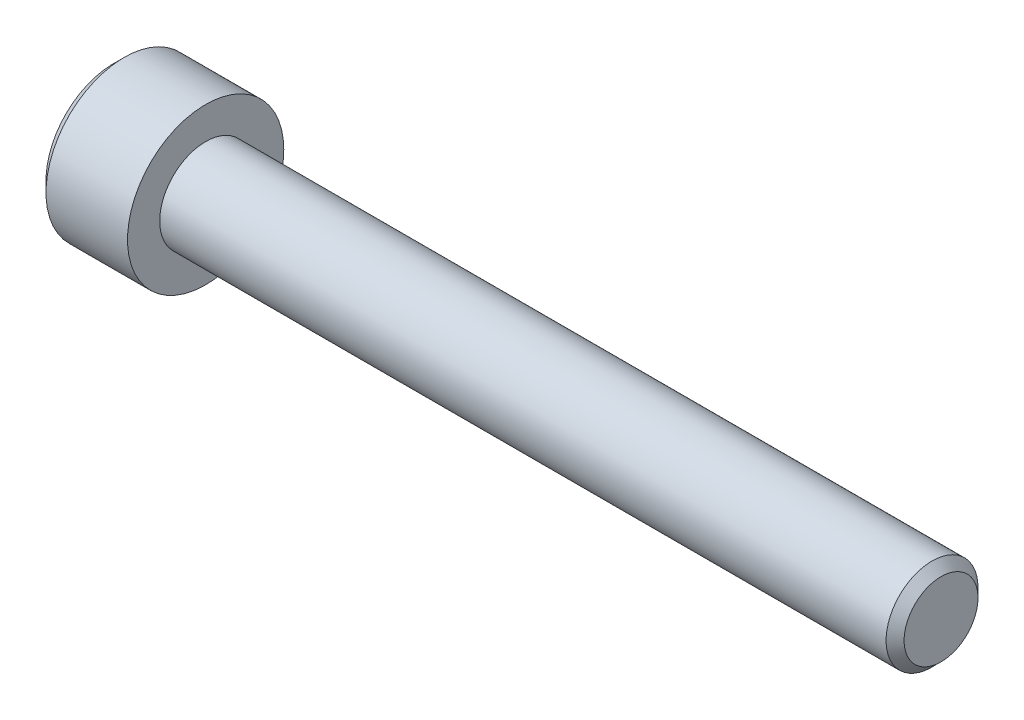
ISO-10303-21;
HEADER;
FILE_DESCRIPTION(('STEP AP214'),'2;1');
FILE_NAME('part.step','',(''),(''),'','','');
FILE_SCHEMA(('AUTOMOTIVE_DESIGN { 1 0 10303 214 1 1 1 1 }'));
ENDSEC;
DATA;
#1=APPLICATION_CONTEXT('core data for automotive mechanical design processes');
#2=APPLICATION_PROTOCOL_DEFINITION('international standard','automotive_design',2000,#1);
#3=PRODUCT_CONTEXT('',#1,'mechanical');
#4=PRODUCT('Part','Part','',(#3));
#5=PRODUCT_RELATED_PRODUCT_CATEGORY('part','',(#4));
#6=PRODUCT_DEFINITION_FORMATION('','',#4);
#7=PRODUCT_DEFINITION_CONTEXT('part definition',#1,'design');
#8=PRODUCT_DEFINITION('design','',#6,#7);
#9=PRODUCT_DEFINITION_SHAPE('','',#8);
#10=(LENGTH_UNIT() NAMED_UNIT(*) SI_UNIT(.MILLI.,.METRE.));
#11=(NAMED_UNIT(*) PLANE_ANGLE_UNIT() SI_UNIT($,.RADIAN.));
#12=(NAMED_UNIT(*) SI_UNIT($,.STERADIAN.) SOLID_ANGLE_UNIT());
#13=UNCERTAINTY_MEASURE_WITH_UNIT(LENGTH_MEASURE(1.E-05),#10,'distance_accuracy_value','');
#14=(GEOMETRIC_REPRESENTATION_CONTEXT(3) GLOBAL_UNCERTAINTY_ASSIGNED_CONTEXT((#13)) GLOBAL_UNIT_ASSIGNED_CONTEXT((#10,
#11,#12)) REPRESENTATION_CONTEXT('',''));
#15=CARTESIAN_POINT('',(0.,0.,0.));
#16=DIRECTION('',(0.,0.,1.));
#17=DIRECTION('',(1.,0.,0.));
#18=AXIS2_PLACEMENT_3D('',#15,#16,#17);
#19=CARTESIAN_POINT('',(-5.,0.,0.));
#20=DIRECTION('',(1.,0.,0.));
#21=DIRECTION('',(0.,0.,-1.));
#22=AXIS2_PLACEMENT_3D('',#19,#20,#21);
#23=PLANE('',#22);
#24=CARTESIAN_POINT('',(-5.,0.,0.));
#25=DIRECTION('',(1.,0.,0.));
#26=DIRECTION('',(0.,0.,-1.));
#27=AXIS2_PLACEMENT_3D('',#24,#25,#26);
#28=CIRCLE('',#27,3.68333333333333);
#29=CARTESIAN_POINT('',(-5.,0.,-3.68333333333333));
#30=VERTEX_POINT('',#29);
#31=EDGE_CURVE('E10',#30,#30,#28,.T.);
#32=ORIENTED_EDGE('',*,*,#31,.F.);
#33=EDGE_LOOP('',(#32));
#34=FACE_BOUND('',#33,.T.);
#35=DIRECTION('',(0.,0.5,-0.866025403784439));
#36=VECTOR('',#35,1.);
#37=CARTESIAN_POINT('',(-5.,-2.3094010767585,0.));
#38=LINE('',#37,#36);
#39=CARTESIAN_POINT('',(-5.,-2.3094010767585,0.));
#40=VERTEX_POINT('',#39);
#41=CARTESIAN_POINT('',(-5.,-1.15470053837925,-2.));
#42=VERTEX_POINT('',#41);
#43=EDGE_CURVE('E152',#40,#42,#38,.T.);
#44=ORIENTED_EDGE('',*,*,#43,.T.);
#45=DIRECTION('',(0.,1.,0.));
#46=VECTOR('',#45,1.);
#47=CARTESIAN_POINT('',(-5.,-1.15470053837925,-2.));
#48=LINE('',#47,#46);
#49=CARTESIAN_POINT('',(-5.,1.15470053837925,-2.));
#50=VERTEX_POINT('',#49);
#51=EDGE_CURVE('E154',#42,#50,#48,.T.);
#52=ORIENTED_EDGE('',*,*,#51,.T.);
#53=DIRECTION('',(0.,0.5,0.866025403784439));
#54=VECTOR('',#53,1.);
#55=CARTESIAN_POINT('',(-5.,1.15470053837925,-2.));
#56=LINE('',#55,#54);
#57=CARTESIAN_POINT('',(-5.,2.3094010767585,0.));
#58=VERTEX_POINT('',#57);
#59=EDGE_CURVE('E157',#50,#58,#56,.T.);
#60=ORIENTED_EDGE('',*,*,#59,.T.);
#61=DIRECTION('',(0.,-0.5,0.866025403784439));
#62=VECTOR('',#61,1.);
#63=CARTESIAN_POINT('',(-5.,2.3094010767585,0.));
#64=LINE('',#63,#62);
#65=CARTESIAN_POINT('',(-5.,1.15470053837925,2.));
#66=VERTEX_POINT('',#65);
#67=EDGE_CURVE('E99',#58,#66,#64,.T.);
#68=ORIENTED_EDGE('',*,*,#67,.T.);
#69=DIRECTION('',(0.,-1.,0.));
#70=VECTOR('',#69,1.);
#71=CARTESIAN_POINT('',(-5.,1.15470053837925,2.));
#72=LINE('',#71,#70);
#73=CARTESIAN_POINT('',(-5.,-1.15470053837925,2.));
#74=VERTEX_POINT('',#73);
#75=EDGE_CURVE('E159',#66,#74,#72,.T.);
#76=ORIENTED_EDGE('',*,*,#75,.T.);
#77=DIRECTION('',(0.,-0.5,-0.866025403784439));
#78=VECTOR('',#77,1.);
#79=CARTESIAN_POINT('',(-5.,-1.15470053837925,2.));
#80=LINE('',#79,#78);
#81=EDGE_CURVE('E114',#74,#40,#80,.T.);
#82=ORIENTED_EDGE('',*,*,#81,.T.);
#83=EDGE_LOOP('',(#44,#52,#60,#68,#76,#82));
#84=FACE_BOUND('',#83,.T.);
#85=ADVANCED_FACE('F16',(#34,#84),#23,.F.);
#86=CARTESIAN_POINT('',(-5.,0.,0.));
#87=DIRECTION('',(1.,0.,0.));
#88=DIRECTION('',(0.,0.,-1.));
#89=AXIS2_PLACEMENT_3D('',#86,#87,#88);
#90=CONICAL_SURFACE('',#89,3.68333333333333,0.785398163397448);
#91=CARTESIAN_POINT('',(-4.43333333333333,0.,0.));
#92=DIRECTION('',(1.,0.,0.));
#93=DIRECTION('',(0.,0.,-1.));
#94=AXIS2_PLACEMENT_3D('',#91,#92,#93);
#95=CIRCLE('',#94,4.25);
#96=CARTESIAN_POINT('',(-4.43333333333333,0.,-4.25));
#97=VERTEX_POINT('',#96);
#98=EDGE_CURVE('E23',#97,#97,#95,.T.);
#99=ORIENTED_EDGE('',*,*,#98,.F.);
#100=EDGE_LOOP('',(#99));
#101=FACE_BOUND('',#100,.T.);
#102=ORIENTED_EDGE('',*,*,#31,.T.);
#103=EDGE_LOOP('',(#102));
#104=FACE_BOUND('',#103,.T.);
#105=ADVANCED_FACE('F143',(#101,#104),#90,.T.);
#106=CARTESIAN_POINT('',(40.,0.,0.));
#107=DIRECTION('',(1.,0.,0.));
#108=DIRECTION('',(0.,0.,-1.));
#109=AXIS2_PLACEMENT_3D('',#106,#107,#108);
#110=CYLINDRICAL_SURFACE('',#109,4.25);
#111=CARTESIAN_POINT('',(0.,0.,0.));
#112=DIRECTION('',(1.,0.,0.));
#113=DIRECTION('',(0.,0.,-1.));
#114=AXIS2_PLACEMENT_3D('',#111,#112,#113);
#115=CIRCLE('',#114,4.25);
#116=CARTESIAN_POINT('',(0.,0.,-4.25));
#117=VERTEX_POINT('',#116);
#118=EDGE_CURVE('E136',#117,#117,#115,.T.);
#119=ORIENTED_EDGE('',*,*,#118,.F.);
#120=EDGE_LOOP('',(#119));
#121=FACE_BOUND('',#120,.T.);
#122=ORIENTED_EDGE('',*,*,#98,.T.);
#123=EDGE_LOOP('',(#122));
#124=FACE_BOUND('',#123,.T.);
#125=ADVANCED_FACE('F141',(#121,#124),#110,.T.);
#126=CARTESIAN_POINT('',(0.,4.25,0.));
#127=DIRECTION('',(-1.,0.,0.));
#128=DIRECTION('',(0.,0.,1.));
#129=AXIS2_PLACEMENT_3D('',#126,#127,#128);
#130=PLANE('',#129);
#131=CARTESIAN_POINT('',(0.,0.,0.));
#132=DIRECTION('',(1.,0.,0.));
#133=DIRECTION('',(0.,0.,-1.));
#134=AXIS2_PLACEMENT_3D('',#131,#132,#133);
#135=CIRCLE('',#134,2.5);
#136=CARTESIAN_POINT('',(0.,0.,-2.5));
#137=VERTEX_POINT('',#136);
#138=EDGE_CURVE('E133',#137,#137,#135,.T.);
#139=ORIENTED_EDGE('',*,*,#138,.F.);
#140=EDGE_LOOP('',(#139));
#141=FACE_BOUND('',#140,.T.);
#142=ORIENTED_EDGE('',*,*,#118,.T.);
#143=EDGE_LOOP('',(#142));
#144=FACE_BOUND('',#143,.T.);
#145=ADVANCED_FACE('F250',(#141,#144),#130,.F.);
#146=CARTESIAN_POINT('',(40.,0.,0.));
#147=DIRECTION('',(1.,0.,0.));
#148=DIRECTION('',(0.,0.,-1.));
#149=AXIS2_PLACEMENT_3D('',#146,#147,#148);
#150=CYLINDRICAL_SURFACE('',#149,2.5);
#151=CARTESIAN_POINT('',(39.5095,0.,0.));
#152=DIRECTION('',(1.,0.,0.));
#153=DIRECTION('',(0.,0.,-1.));
#154=AXIS2_PLACEMENT_3D('',#151,#152,#153);
#155=CIRCLE('',#154,2.5);
#156=CARTESIAN_POINT('',(39.5095,0.,-2.5));
#157=VERTEX_POINT('',#156);
#158=EDGE_CURVE('E130',#157,#157,#155,.T.);
#159=ORIENTED_EDGE('',*,*,#158,.F.);
#160=EDGE_LOOP('',(#159));
#161=FACE_BOUND('',#160,.T.);
#162=ORIENTED_EDGE('',*,*,#138,.T.);
#163=EDGE_LOOP('',(#162));
#164=FACE_BOUND('',#163,.T.);
#165=ADVANCED_FACE('F246',(#161,#164),#150,.T.);
#166=CARTESIAN_POINT('',(39.5095,0.,0.));
#167=DIRECTION('',(-1.,0.,0.));
#168=DIRECTION('',(0.,0.,1.));
#169=AXIS2_PLACEMENT_3D('',#166,#167,#168);
#170=CONICAL_SURFACE('',#169,2.5,0.78539816339745);
#171=CARTESIAN_POINT('',(40.,0.,0.));
#172=DIRECTION('',(1.,0.,0.));
#173=DIRECTION('',(0.,0.,-1.));
#174=AXIS2_PLACEMENT_3D('',#171,#172,#173);
#175=CIRCLE('',#174,2.0095);
#176=CARTESIAN_POINT('',(40.,0.,-2.0095));
#177=VERTEX_POINT('',#176);
#178=EDGE_CURVE('E126',#177,#177,#175,.T.);
#179=ORIENTED_EDGE('',*,*,#178,.F.);
#180=EDGE_LOOP('',(#179));
#181=FACE_BOUND('',#180,.T.);
#182=ORIENTED_EDGE('',*,*,#158,.T.);
#183=EDGE_LOOP('',(#182));
#184=FACE_BOUND('',#183,.T.);
#185=ADVANCED_FACE('F242',(#181,#184),#170,.T.);
#186=CARTESIAN_POINT('',(40.,2.0095,0.));
#187=DIRECTION('',(-1.,0.,0.));
#188=DIRECTION('',(0.,0.,1.));
#189=AXIS2_PLACEMENT_3D('',#186,#187,#188);
#190=PLANE('',#189);
#191=ORIENTED_EDGE('',*,*,#178,.T.);
#192=EDGE_LOOP('',(#191));
#193=FACE_BOUND('',#192,.T.);
#194=ADVANCED_FACE('F237',(#193),#190,.F.);
#195=CARTESIAN_POINT('',(-2.5,1.15470053837925,2.));
#196=DIRECTION('',(0.,0.,-1.));
#197=DIRECTION('',(-1.,0.,0.));
#198=AXIS2_PLACEMENT_3D('',#195,#196,#197);
#199=PLANE('',#198);
#200=ORIENTED_EDGE('',*,*,#75,.F.);
#201=DIRECTION('',(-1.,0.,0.));
#202=VECTOR('',#201,1.);
#203=CARTESIAN_POINT('',(-2.5,1.15470053837925,2.));
#204=LINE('',#203,#202);
#205=CARTESIAN_POINT('',(-2.5,1.15470053837925,2.));
#206=VERTEX_POINT('',#205);
#207=EDGE_CURVE('E166',#206,#66,#204,.T.);
#208=ORIENTED_EDGE('',*,*,#207,.F.);
#209=DIRECTION('',(0.,-1.,0.));
#210=VECTOR('',#209,1.);
#211=CARTESIAN_POINT('',(-2.5,1.15470053837925,2.));
#212=LINE('',#211,#210);
#213=CARTESIAN_POINT('',(-2.5,0.,2.));
#214=VERTEX_POINT('',#213);
#215=EDGE_CURVE('E96',#206,#214,#212,.T.);
#216=ORIENTED_EDGE('',*,*,#215,.T.);
#217=CARTESIAN_POINT('',(-2.5,-1.15470053837925,2.));
#218=VERTEX_POINT('',#217);
#219=EDGE_CURVE('E88',#214,#218,#212,.T.);
#220=ORIENTED_EDGE('',*,*,#219,.T.);
#221=DIRECTION('',(-1.,0.,0.));
#222=VECTOR('',#221,1.);
#223=CARTESIAN_POINT('',(-2.5,-1.15470053837925,2.));
#224=LINE('',#223,#222);
#225=EDGE_CURVE('E92',#218,#74,#224,.T.);
#226=ORIENTED_EDGE('',*,*,#225,.T.);
#227=EDGE_LOOP('',(#200,#208,#216,#220,#226));
#228=FACE_BOUND('',#227,.T.);
#229=ADVANCED_FACE('F90',(#228),#199,.T.);
#230=CARTESIAN_POINT('',(-2.5,-1.15470053837925,2.));
#231=DIRECTION('',(0.,0.866025403784439,-0.5));
#232=DIRECTION('',(0.,0.5,0.866025403784439));
#233=AXIS2_PLACEMENT_3D('',#230,#231,#232);
#234=PLANE('',#233);
#235=ORIENTED_EDGE('',*,*,#81,.F.);
#236=ORIENTED_EDGE('',*,*,#225,.F.);
#237=DIRECTION('',(0.,-0.5,-0.866025403784439));
#238=VECTOR('',#237,1.);
#239=CARTESIAN_POINT('',(-2.5,-1.15470053837925,2.));
#240=LINE('',#239,#238);
#241=CARTESIAN_POINT('',(-2.5,-1.73205080756888,1.));
#242=VERTEX_POINT('',#241);
#243=EDGE_CURVE('E102',#218,#242,#240,.T.);
#244=ORIENTED_EDGE('',*,*,#243,.T.);
#245=CARTESIAN_POINT('',(-2.5,-2.3094010767585,0.));
#246=VERTEX_POINT('',#245);
#247=EDGE_CURVE('E109',#242,#246,#240,.T.);
#248=ORIENTED_EDGE('',*,*,#247,.T.);
#249=DIRECTION('',(-1.,0.,0.));
#250=VECTOR('',#249,1.);
#251=CARTESIAN_POINT('',(-2.5,-2.3094010767585,0.));
#252=LINE('',#251,#250);
#253=EDGE_CURVE('E116',#246,#40,#252,.T.);
#254=ORIENTED_EDGE('',*,*,#253,.T.);
#255=EDGE_LOOP('',(#235,#236,#244,#248,#254));
#256=FACE_BOUND('',#255,.T.);
#257=ADVANCED_FACE('F111',(#256),#234,.T.);
#258=CARTESIAN_POINT('',(-2.5,-2.3094010767585,0.));
#259=DIRECTION('',(0.,0.866025403784439,0.5));
#260=DIRECTION('',(0.,-0.5,0.866025403784439));
#261=AXIS2_PLACEMENT_3D('',#258,#259,#260);
#262=PLANE('',#261);
#263=ORIENTED_EDGE('',*,*,#43,.F.);
#264=ORIENTED_EDGE('',*,*,#253,.F.);
#265=DIRECTION('',(0.,0.5,-0.866025403784439));
#266=VECTOR('',#265,1.);
#267=CARTESIAN_POINT('',(-2.5,-2.3094010767585,0.));
#268=LINE('',#267,#266);
#269=CARTESIAN_POINT('',(-2.5,-1.73205080756888,-1.));
#270=VERTEX_POINT('',#269);
#271=EDGE_CURVE('E30',#246,#270,#268,.T.);
#272=ORIENTED_EDGE('',*,*,#271,.T.);
#273=CARTESIAN_POINT('',(-2.5,-1.15470053837925,-2.));
#274=VERTEX_POINT('',#273);
#275=EDGE_CURVE('E108',#270,#274,#268,.T.);
#276=ORIENTED_EDGE('',*,*,#275,.T.);
#277=DIRECTION('',(-1.,0.,0.));
#278=VECTOR('',#277,1.);
#279=CARTESIAN_POINT('',(-2.5,-1.15470053837925,-2.));
#280=LINE('',#279,#278);
#281=EDGE_CURVE('E122',#274,#42,#280,.T.);
#282=ORIENTED_EDGE('',*,*,#281,.T.);
#283=EDGE_LOOP('',(#263,#264,#272,#276,#282));
#284=FACE_BOUND('',#283,.T.);
#285=ADVANCED_FACE('F176',(#284),#262,.T.);
#286=CARTESIAN_POINT('',(-2.5,-1.15470053837925,-2.));
#287=DIRECTION('',(0.,0.,1.));
#288=DIRECTION('',(1.,0.,0.));
#289=AXIS2_PLACEMENT_3D('',#286,#287,#288);
#290=PLANE('',#289);
#291=ORIENTED_EDGE('',*,*,#51,.F.);
#292=ORIENTED_EDGE('',*,*,#281,.F.);
#293=DIRECTION('',(0.,1.,0.));
#294=VECTOR('',#293,1.);
#295=CARTESIAN_POINT('',(-2.5,-1.15470053837925,-2.));
#296=LINE('',#295,#294);
#297=CARTESIAN_POINT('',(-2.5,0.,-2.));
#298=VERTEX_POINT('',#297);
#299=EDGE_CURVE('E181',#274,#298,#296,.T.);
#300=ORIENTED_EDGE('',*,*,#299,.T.);
#301=CARTESIAN_POINT('',(-2.5,1.15470053837925,-2.));
#302=VERTEX_POINT('',#301);
#303=EDGE_CURVE('E189',#298,#302,#296,.T.);
#304=ORIENTED_EDGE('',*,*,#303,.T.);
#305=DIRECTION('',(-1.,0.,0.));
#306=VECTOR('',#305,1.);
#307=CARTESIAN_POINT('',(-2.5,1.15470053837925,-2.));
#308=LINE('',#307,#306);
#309=EDGE_CURVE('E173',#302,#50,#308,.T.);
#310=ORIENTED_EDGE('',*,*,#309,.T.);
#311=EDGE_LOOP('',(#291,#292,#300,#304,#310));
#312=FACE_BOUND('',#311,.T.);
#313=ADVANCED_FACE('F180',(#312),#290,.T.);
#314=CARTESIAN_POINT('',(-2.5,1.15470053837925,-2.));
#315=DIRECTION('',(0.,-0.866025403784439,0.5));
#316=DIRECTION('',(0.,-0.5,-0.866025403784439));
#317=AXIS2_PLACEMENT_3D('',#314,#315,#316);
#318=PLANE('',#317);
#319=ORIENTED_EDGE('',*,*,#59,.F.);
#320=ORIENTED_EDGE('',*,*,#309,.F.);
#321=DIRECTION('',(0.,0.5,0.866025403784439));
#322=VECTOR('',#321,1.);
#323=CARTESIAN_POINT('',(-2.5,1.15470053837925,-2.));
#324=LINE('',#323,#322);
#325=CARTESIAN_POINT('',(-2.5,1.73205080756888,-1.));
#326=VERTEX_POINT('',#325);
#327=EDGE_CURVE('E191',#302,#326,#324,.T.);
#328=ORIENTED_EDGE('',*,*,#327,.T.);
#329=CARTESIAN_POINT('',(-2.5,2.3094010767585,0.));
#330=VERTEX_POINT('',#329);
#331=EDGE_CURVE('E188',#326,#330,#324,.T.);
#332=ORIENTED_EDGE('',*,*,#331,.T.);
#333=DIRECTION('',(-1.,0.,0.));
#334=VECTOR('',#333,1.);
#335=CARTESIAN_POINT('',(-2.5,2.3094010767585,0.));
#336=LINE('',#335,#334);
#337=EDGE_CURVE('E169',#330,#58,#336,.T.);
#338=ORIENTED_EDGE('',*,*,#337,.T.);
#339=EDGE_LOOP('',(#319,#320,#328,#332,#338));
#340=FACE_BOUND('',#339,.T.);
#341=ADVANCED_FACE('F219',(#340),#318,.T.);
#342=CARTESIAN_POINT('',(-2.5,2.3094010767585,0.));
#343=DIRECTION('',(0.,-0.866025403784439,-0.5));
#344=DIRECTION('',(0.,0.5,-0.866025403784439));
#345=AXIS2_PLACEMENT_3D('',#342,#343,#344);
#346=PLANE('',#345);
#347=ORIENTED_EDGE('',*,*,#67,.F.);
#348=ORIENTED_EDGE('',*,*,#337,.F.);
#349=DIRECTION('',(0.,-0.5,0.866025403784439));
#350=VECTOR('',#349,1.);
#351=CARTESIAN_POINT('',(-2.5,2.3094010767585,0.));
#352=LINE('',#351,#350);
#353=CARTESIAN_POINT('',(-2.5,1.73205080756888,1.));
#354=VERTEX_POINT('',#353);
#355=EDGE_CURVE('E170',#330,#354,#352,.T.);
#356=ORIENTED_EDGE('',*,*,#355,.T.);
#357=EDGE_CURVE('E196',#354,#206,#352,.T.);
#358=ORIENTED_EDGE('',*,*,#357,.T.);
#359=ORIENTED_EDGE('',*,*,#207,.T.);
#360=EDGE_LOOP('',(#347,#348,#356,#358,#359));
#361=FACE_BOUND('',#360,.T.);
#362=ADVANCED_FACE('F199',(#361),#346,.T.);
#363=CARTESIAN_POINT('',(-2.5,0.,0.));
#364=DIRECTION('',(1.,0.,0.));
#365=DIRECTION('',(0.,0.,-1.));
#366=AXIS2_PLACEMENT_3D('',#363,#364,#365);
#367=PLANE('',#366);
#368=CARTESIAN_POINT('',(-2.5,0.,0.));
#369=DIRECTION('',(1.,0.,0.));
#370=DIRECTION('',(0.,0.,-1.));
#371=AXIS2_PLACEMENT_3D('',#368,#369,#370);
#372=CIRCLE('',#371,2.);
#373=EDGE_CURVE('E115',#298,#326,#372,.T.);
#374=ORIENTED_EDGE('',*,*,#373,.T.);
#375=ORIENTED_EDGE('',*,*,#327,.F.);
#376=ORIENTED_EDGE('',*,*,#303,.F.);
#377=EDGE_LOOP('',(#374,#375,#376));
#378=FACE_BOUND('',#377,.T.);
#379=ADVANCED_FACE('F214',(#378),#367,.F.);
#380=ORIENTED_EDGE('',*,*,#331,.F.);
#381=EDGE_CURVE('E121',#326,#354,#372,.T.);
#382=ORIENTED_EDGE('',*,*,#381,.T.);
#383=ORIENTED_EDGE('',*,*,#355,.F.);
#384=EDGE_LOOP('',(#380,#382,#383));
#385=FACE_BOUND('',#384,.T.);
#386=ADVANCED_FACE('F216',(#385),#367,.F.);
#387=EDGE_CURVE('E127',#354,#214,#372,.T.);
#388=ORIENTED_EDGE('',*,*,#387,.T.);
#389=ORIENTED_EDGE('',*,*,#215,.F.);
#390=ORIENTED_EDGE('',*,*,#357,.F.);
#391=EDGE_LOOP('',(#388,#389,#390));
#392=FACE_BOUND('',#391,.T.);
#393=ADVANCED_FACE('F205',(#392),#367,.F.);
#394=EDGE_CURVE('E104',#214,#242,#372,.T.);
#395=ORIENTED_EDGE('',*,*,#394,.T.);
#396=ORIENTED_EDGE('',*,*,#243,.F.);
#397=ORIENTED_EDGE('',*,*,#219,.F.);
#398=EDGE_LOOP('',(#395,#396,#397));
#399=FACE_BOUND('',#398,.T.);
#400=ADVANCED_FACE('F103',(#399),#367,.F.);
#401=EDGE_CURVE('E208',#242,#270,#372,.T.);
#402=ORIENTED_EDGE('',*,*,#401,.T.);
#403=ORIENTED_EDGE('',*,*,#271,.F.);
#404=ORIENTED_EDGE('',*,*,#247,.F.);
#405=EDGE_LOOP('',(#402,#403,#404));
#406=FACE_BOUND('',#405,.T.);
#407=ADVANCED_FACE('F207',(#406),#367,.F.);
#408=EDGE_CURVE('E119',#270,#298,#372,.T.);
#409=ORIENTED_EDGE('',*,*,#408,.T.);
#410=ORIENTED_EDGE('',*,*,#299,.F.);
#411=ORIENTED_EDGE('',*,*,#275,.F.);
#412=EDGE_LOOP('',(#409,#410,#411));
#413=FACE_BOUND('',#412,.T.);
#414=ADVANCED_FACE('F184',(#413),#367,.F.);
#415=CARTESIAN_POINT('',(-2.5,0.,0.));
#416=DIRECTION('',(-1.,0.,0.));
#417=DIRECTION('',(0.,0.,1.));
#418=AXIS2_PLACEMENT_3D('',#415,#416,#417);
#419=CONICAL_SURFACE('',#418,2.,1.30899693899575);
#420=CARTESIAN_POINT('',(-1.96410161513776,0.,0.));
#421=VERTEX_POINT('',#420);
#422=VERTEX_LOOP('',#421);
#423=FACE_BOUND('',#422,.T.);
#424=ORIENTED_EDGE('',*,*,#381,.F.);
#425=ORIENTED_EDGE('',*,*,#373,.F.);
#426=ORIENTED_EDGE('',*,*,#408,.F.);
#427=ORIENTED_EDGE('',*,*,#401,.F.);
#428=ORIENTED_EDGE('',*,*,#394,.F.);
#429=ORIENTED_EDGE('',*,*,#387,.F.);
#430=EDGE_LOOP('',(#424,#425,#426,#427,#428,#429));
#431=FACE_BOUND('',#430,.T.);
#432=ADVANCED_FACE('F210',(#423,#431),#419,.F.);
#433=CLOSED_SHELL('',(#85,#105,#125,#145,#165,#185,#194,#229,#257,#285,#313,#341,#362,#379,#386,
#393,#400,#407,#414,#432));
#434=MANIFOLD_SOLID_BREP('B1',#433);
#435=ADVANCED_BREP_SHAPE_REPRESENTATION('',(#18,#434),#14);
#436=SHAPE_DEFINITION_REPRESENTATION(#9,#435);
ENDSEC;
END-ISO-10303-21;
